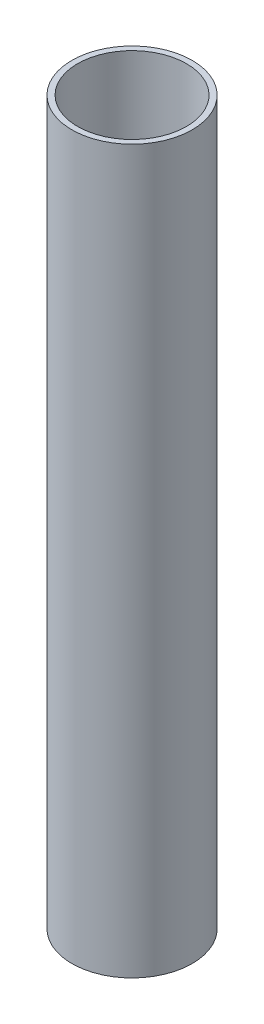
ISO-10303-21;
HEADER;
FILE_DESCRIPTION(('STEP AP214'),'2;1');
FILE_NAME('part.step','',(''),(''),'','','');
FILE_SCHEMA(('AUTOMOTIVE_DESIGN { 1 0 10303 214 1 1 1 1 }'));
ENDSEC;
DATA;
#1=APPLICATION_CONTEXT('core data for automotive mechanical design processes');
#2=APPLICATION_PROTOCOL_DEFINITION('international standard','automotive_design',2000,#1);
#3=PRODUCT_CONTEXT('',#1,'mechanical');
#4=PRODUCT('Part','Part','',(#3));
#5=PRODUCT_RELATED_PRODUCT_CATEGORY('part','',(#4));
#6=PRODUCT_DEFINITION_FORMATION('','',#4);
#7=PRODUCT_DEFINITION_CONTEXT('part definition',#1,'design');
#8=PRODUCT_DEFINITION('design','',#6,#7);
#9=PRODUCT_DEFINITION_SHAPE('','',#8);
#10=(LENGTH_UNIT() NAMED_UNIT(*) SI_UNIT(.MILLI.,.METRE.));
#11=(NAMED_UNIT(*) PLANE_ANGLE_UNIT() SI_UNIT($,.RADIAN.));
#12=(NAMED_UNIT(*) SI_UNIT($,.STERADIAN.) SOLID_ANGLE_UNIT());
#13=UNCERTAINTY_MEASURE_WITH_UNIT(LENGTH_MEASURE(1.E-05),#10,'distance_accuracy_value','');
#14=(GEOMETRIC_REPRESENTATION_CONTEXT(3) GLOBAL_UNCERTAINTY_ASSIGNED_CONTEXT((#13)) GLOBAL_UNIT_ASSIGNED_CONTEXT((#10,
#11,#12)) REPRESENTATION_CONTEXT('',''));
#15=CARTESIAN_POINT('',(0.,0.,0.));
#16=DIRECTION('',(0.,0.,1.));
#17=DIRECTION('',(1.,0.,0.));
#18=AXIS2_PLACEMENT_3D('',#15,#16,#17);
#19=CARTESIAN_POINT('',(0.,304.8,0.));
#20=DIRECTION('',(0.,1.,0.));
#21=DIRECTION('',(0.,0.,1.));
#22=AXIS2_PLACEMENT_3D('',#19,#20,#21);
#23=PLANE('',#22);
#24=CARTESIAN_POINT('',(0.,304.8,0.));
#25=DIRECTION('',(0.,1.,0.));
#26=DIRECTION('',(0.,0.,1.));
#27=AXIS2_PLACEMENT_3D('',#24,#25,#26);
#28=CIRCLE('',#27,25.4);
#29=CARTESIAN_POINT('',(0.,304.8,-25.4));
#30=VERTEX_POINT('',#29);
#31=EDGE_CURVE('E10',#30,#30,#28,.T.);
#32=ORIENTED_EDGE('',*,*,#31,.T.);
#33=EDGE_LOOP('',(#32));
#34=FACE_BOUND('',#33,.T.);
#35=CARTESIAN_POINT('',(0.,304.8,0.));
#36=DIRECTION('',(0.,1.,0.));
#37=DIRECTION('',(0.,0.,1.));
#38=AXIS2_PLACEMENT_3D('',#35,#36,#37);
#39=CIRCLE('',#38,22.987);
#40=CARTESIAN_POINT('',(0.,304.8,-22.987));
#41=VERTEX_POINT('',#40);
#42=EDGE_CURVE('E50',#41,#41,#39,.T.);
#43=ORIENTED_EDGE('',*,*,#42,.F.);
#44=EDGE_LOOP('',(#43));
#45=FACE_BOUND('',#44,.T.);
#46=ADVANCED_FACE('F37',(#34,#45),#23,.T.);
#47=CARTESIAN_POINT('',(0.,0.,0.));
#48=DIRECTION('',(0.,1.,0.));
#49=DIRECTION('',(0.,0.,1.));
#50=AXIS2_PLACEMENT_3D('',#47,#48,#49);
#51=PLANE('',#50);
#52=CARTESIAN_POINT('',(0.,0.,0.));
#53=DIRECTION('',(0.,1.,0.));
#54=DIRECTION('',(0.,0.,1.));
#55=AXIS2_PLACEMENT_3D('',#52,#53,#54);
#56=CIRCLE('',#55,25.4);
#57=CARTESIAN_POINT('',(0.,0.,-25.4));
#58=VERTEX_POINT('',#57);
#59=EDGE_CURVE('E41',#58,#58,#56,.T.);
#60=ORIENTED_EDGE('',*,*,#59,.F.);
#61=EDGE_LOOP('',(#60));
#62=FACE_BOUND('',#61,.T.);
#63=CARTESIAN_POINT('',(0.,0.,0.));
#64=DIRECTION('',(0.,1.,0.));
#65=DIRECTION('',(0.,0.,1.));
#66=AXIS2_PLACEMENT_3D('',#63,#64,#65);
#67=CIRCLE('',#66,22.987);
#68=CARTESIAN_POINT('',(0.,0.,-22.987));
#69=VERTEX_POINT('',#68);
#70=EDGE_CURVE('E52',#69,#69,#67,.T.);
#71=ORIENTED_EDGE('',*,*,#70,.T.);
#72=EDGE_LOOP('',(#71));
#73=FACE_BOUND('',#72,.T.);
#74=ADVANCED_FACE('F64',(#62,#73),#51,.F.);
#75=CARTESIAN_POINT('',(0.,304.8,0.));
#76=DIRECTION('',(0.,-1.,0.));
#77=DIRECTION('',(0.,0.,-1.));
#78=AXIS2_PLACEMENT_3D('',#75,#76,#77);
#79=CYLINDRICAL_SURFACE('',#78,25.4);
#80=CARTESIAN_POINT('',(0.,304.8,-25.4));
#81=CARTESIAN_POINT('',(0.,301.625,-25.4));
#82=CARTESIAN_POINT('',(0.,298.45,-25.4));
#83=CARTESIAN_POINT('',(0.,292.1,-25.4));
#84=CARTESIAN_POINT('',(0.,288.925,-25.4));
#85=CARTESIAN_POINT('',(0.,282.575,-25.4));
#86=CARTESIAN_POINT('',(0.,279.4,-25.4));
#87=CARTESIAN_POINT('',(0.,273.05,-25.4));
#88=CARTESIAN_POINT('',(0.,269.875,-25.4));
#89=CARTESIAN_POINT('',(0.,263.525,-25.4));
#90=CARTESIAN_POINT('',(0.,260.35,-25.4));
#91=CARTESIAN_POINT('',(0.,254.,-25.4));
#92=CARTESIAN_POINT('',(0.,250.825,-25.4));
#93=CARTESIAN_POINT('',(0.,244.475,-25.4));
#94=CARTESIAN_POINT('',(0.,241.3,-25.4));
#95=CARTESIAN_POINT('',(0.,234.95,-25.4));
#96=CARTESIAN_POINT('',(0.,231.775,-25.4));
#97=CARTESIAN_POINT('',(0.,225.425,-25.4));
#98=CARTESIAN_POINT('',(0.,222.25,-25.4));
#99=CARTESIAN_POINT('',(0.,215.9,-25.4));
#100=CARTESIAN_POINT('',(0.,212.725,-25.4));
#101=CARTESIAN_POINT('',(0.,206.375,-25.4));
#102=CARTESIAN_POINT('',(0.,203.2,-25.4));
#103=CARTESIAN_POINT('',(0.,196.85,-25.4));
#104=CARTESIAN_POINT('',(0.,193.675,-25.4));
#105=CARTESIAN_POINT('',(0.,187.325,-25.4));
#106=CARTESIAN_POINT('',(0.,184.15,-25.4));
#107=CARTESIAN_POINT('',(0.,177.8,-25.4));
#108=CARTESIAN_POINT('',(0.,174.625,-25.4));
#109=CARTESIAN_POINT('',(0.,168.275,-25.4));
#110=CARTESIAN_POINT('',(0.,165.1,-25.4));
#111=CARTESIAN_POINT('',(0.,158.75,-25.4));
#112=CARTESIAN_POINT('',(0.,155.575,-25.4));
#113=CARTESIAN_POINT('',(0.,149.225,-25.4));
#114=CARTESIAN_POINT('',(0.,146.05,-25.4));
#115=CARTESIAN_POINT('',(0.,139.7,-25.4));
#116=CARTESIAN_POINT('',(0.,136.525,-25.4));
#117=CARTESIAN_POINT('',(0.,130.175,-25.4));
#118=CARTESIAN_POINT('',(0.,127.,-25.4));
#119=CARTESIAN_POINT('',(0.,120.65,-25.4));
#120=CARTESIAN_POINT('',(0.,117.475,-25.4));
#121=CARTESIAN_POINT('',(0.,111.125,-25.4));
#122=CARTESIAN_POINT('',(0.,107.95,-25.4));
#123=CARTESIAN_POINT('',(0.,101.6,-25.4));
#124=CARTESIAN_POINT('',(0.,98.425,-25.4));
#125=CARTESIAN_POINT('',(0.,92.075,-25.4));
#126=CARTESIAN_POINT('',(0.,88.9,-25.4));
#127=CARTESIAN_POINT('',(0.,82.55,-25.4));
#128=CARTESIAN_POINT('',(0.,79.375,-25.4));
#129=CARTESIAN_POINT('',(0.,73.025,-25.4));
#130=CARTESIAN_POINT('',(0.,69.85,-25.4));
#131=CARTESIAN_POINT('',(0.,63.5,-25.4));
#132=CARTESIAN_POINT('',(0.,60.325,-25.4));
#133=CARTESIAN_POINT('',(0.,53.975,-25.4));
#134=CARTESIAN_POINT('',(0.,50.8,-25.4));
#135=CARTESIAN_POINT('',(0.,44.45,-25.4));
#136=CARTESIAN_POINT('',(0.,41.275,-25.4));
#137=CARTESIAN_POINT('',(0.,34.925,-25.4));
#138=CARTESIAN_POINT('',(0.,31.75,-25.4));
#139=CARTESIAN_POINT('',(0.,25.4,-25.4));
#140=CARTESIAN_POINT('',(0.,22.225,-25.4));
#141=CARTESIAN_POINT('',(0.,15.875,-25.4));
#142=CARTESIAN_POINT('',(0.,12.7,-25.4));
#143=CARTESIAN_POINT('',(0.,6.35,-25.4));
#144=CARTESIAN_POINT('',(0.,3.175,-25.4));
#145=CARTESIAN_POINT('',(0.,0.,-25.4));
#146=B_SPLINE_CURVE_WITH_KNOTS('',3,(#80,#81,#82,#83,#84,#85,#86,#87,#88,#89,#90,#91,#92,#93,
#94,#95,#96,#97,#98,#99,#100,#101,#102,#103,#104,#105,#106,#107,#108,#109,#110,#111,#112,#113,
#114,#115,#116,#117,#118,#119,#120,#121,#122,#123,#124,#125,#126,#127,#128,#129,#130,#131,#132,
#133,#134,#135,#136,#137,#138,#139,#140,#141,#142,#143,#144,#145),.UNSPECIFIED.,.F.,.F.,(4,2,2,
2,2,2,2,2,2,2,2,2,2,2,2,2,2,2,2,2,2,2,2,2,2,2,2,2,2,2,2,2,4),(0.,9.52499999999995,19.05,28.575,
38.1,47.625,57.15,66.675,76.2,85.725,95.2499999999999,104.775,114.3,123.825,133.35,142.875,
152.4,161.925,171.45,180.975,190.5,200.025,209.55,219.075,228.6,238.125,247.65,257.175,266.7,
276.225,285.75,295.275,304.8),.UNSPECIFIED.);
#147=EDGE_CURVE('BSEAM39',#30,#58,#146,.T.);
#148=ORIENTED_EDGE('',*,*,#31,.F.);
#149=ORIENTED_EDGE('',*,*,#59,.T.);
#150=ORIENTED_EDGE('',*,*,#147,.T.);
#151=ORIENTED_EDGE('',*,*,#147,.F.);
#152=EDGE_LOOP('',(#148,#150,#149,#151));
#153=FACE_BOUND('',#152,.T.);
#154=ADVANCED_FACE('F39',(#153),#79,.T.);
#155=CARTESIAN_POINT('',(0.,304.8,0.));
#156=DIRECTION('',(0.,-1.,0.));
#157=DIRECTION('',(0.,0.,-1.));
#158=AXIS2_PLACEMENT_3D('',#155,#156,#157);
#159=CYLINDRICAL_SURFACE('',#158,22.987);
#160=CARTESIAN_POINT('',(0.,304.8,-22.987));
#161=CARTESIAN_POINT('',(0.,301.625,-22.987));
#162=CARTESIAN_POINT('',(0.,298.45,-22.987));
#163=CARTESIAN_POINT('',(0.,292.1,-22.987));
#164=CARTESIAN_POINT('',(0.,288.925,-22.987));
#165=CARTESIAN_POINT('',(0.,282.575,-22.987));
#166=CARTESIAN_POINT('',(0.,279.4,-22.987));
#167=CARTESIAN_POINT('',(0.,273.05,-22.987));
#168=CARTESIAN_POINT('',(0.,269.875,-22.987));
#169=CARTESIAN_POINT('',(0.,263.525,-22.987));
#170=CARTESIAN_POINT('',(0.,260.35,-22.987));
#171=CARTESIAN_POINT('',(0.,254.,-22.987));
#172=CARTESIAN_POINT('',(0.,250.825,-22.987));
#173=CARTESIAN_POINT('',(0.,244.475,-22.987));
#174=CARTESIAN_POINT('',(0.,241.3,-22.987));
#175=CARTESIAN_POINT('',(0.,234.95,-22.987));
#176=CARTESIAN_POINT('',(0.,231.775,-22.987));
#177=CARTESIAN_POINT('',(0.,225.425,-22.987));
#178=CARTESIAN_POINT('',(0.,222.25,-22.987));
#179=CARTESIAN_POINT('',(0.,215.9,-22.987));
#180=CARTESIAN_POINT('',(0.,212.725,-22.987));
#181=CARTESIAN_POINT('',(0.,206.375,-22.987));
#182=CARTESIAN_POINT('',(0.,203.2,-22.987));
#183=CARTESIAN_POINT('',(0.,196.85,-22.987));
#184=CARTESIAN_POINT('',(0.,193.675,-22.987));
#185=CARTESIAN_POINT('',(0.,187.325,-22.987));
#186=CARTESIAN_POINT('',(0.,184.15,-22.987));
#187=CARTESIAN_POINT('',(0.,177.8,-22.987));
#188=CARTESIAN_POINT('',(0.,174.625,-22.987));
#189=CARTESIAN_POINT('',(0.,168.275,-22.987));
#190=CARTESIAN_POINT('',(0.,165.1,-22.987));
#191=CARTESIAN_POINT('',(0.,158.75,-22.987));
#192=CARTESIAN_POINT('',(0.,155.575,-22.987));
#193=CARTESIAN_POINT('',(0.,149.225,-22.987));
#194=CARTESIAN_POINT('',(0.,146.05,-22.987));
#195=CARTESIAN_POINT('',(0.,139.7,-22.987));
#196=CARTESIAN_POINT('',(0.,136.525,-22.987));
#197=CARTESIAN_POINT('',(0.,130.175,-22.987));
#198=CARTESIAN_POINT('',(0.,127.,-22.987));
#199=CARTESIAN_POINT('',(0.,120.65,-22.987));
#200=CARTESIAN_POINT('',(0.,117.475,-22.987));
#201=CARTESIAN_POINT('',(0.,111.125,-22.987));
#202=CARTESIAN_POINT('',(0.,107.95,-22.987));
#203=CARTESIAN_POINT('',(0.,101.6,-22.987));
#204=CARTESIAN_POINT('',(0.,98.425,-22.987));
#205=CARTESIAN_POINT('',(0.,92.075,-22.987));
#206=CARTESIAN_POINT('',(0.,88.9,-22.987));
#207=CARTESIAN_POINT('',(0.,82.55,-22.987));
#208=CARTESIAN_POINT('',(0.,79.375,-22.987));
#209=CARTESIAN_POINT('',(0.,73.025,-22.987));
#210=CARTESIAN_POINT('',(0.,69.85,-22.987));
#211=CARTESIAN_POINT('',(0.,63.5,-22.987));
#212=CARTESIAN_POINT('',(0.,60.325,-22.987));
#213=CARTESIAN_POINT('',(0.,53.975,-22.987));
#214=CARTESIAN_POINT('',(0.,50.8,-22.987));
#215=CARTESIAN_POINT('',(0.,44.45,-22.987));
#216=CARTESIAN_POINT('',(0.,41.275,-22.987));
#217=CARTESIAN_POINT('',(0.,34.925,-22.987));
#218=CARTESIAN_POINT('',(0.,31.75,-22.987));
#219=CARTESIAN_POINT('',(0.,25.4,-22.987));
#220=CARTESIAN_POINT('',(0.,22.225,-22.987));
#221=CARTESIAN_POINT('',(0.,15.875,-22.987));
#222=CARTESIAN_POINT('',(0.,12.7,-22.987));
#223=CARTESIAN_POINT('',(0.,6.35,-22.987));
#224=CARTESIAN_POINT('',(0.,3.175,-22.987));
#225=CARTESIAN_POINT('',(0.,0.,-22.987));
#226=B_SPLINE_CURVE_WITH_KNOTS('',3,(#160,#161,#162,#163,#164,#165,#166,#167,#168,#169,#170,
#171,#172,#173,#174,#175,#176,#177,#178,#179,#180,#181,#182,#183,#184,#185,#186,#187,#188,#189,
#190,#191,#192,#193,#194,#195,#196,#197,#198,#199,#200,#201,#202,#203,#204,#205,#206,#207,#208,
#209,#210,#211,#212,#213,#214,#215,#216,#217,#218,#219,#220,#221,#222,#223,#224,#225),
.UNSPECIFIED.,.F.,.F.,(4,2,2,2,2,2,2,2,2,2,2,2,2,2,2,2,2,2,2,2,2,2,2,2,2,2,2,2,2,2,2,2,4),(0.,
9.52500000000001,19.05,28.575,38.1,47.625,57.15,66.675,76.2,85.7250000000001,95.2500000000001,
104.775,114.3,123.825,133.35,142.875,152.4,161.925,171.45,180.975,190.5,200.025,209.55,219.075,
228.6,238.125,247.65,257.175,266.7,276.225,285.75,295.275,304.8),.UNSPECIFIED.);
#227=EDGE_CURVE('BSEAM60',#41,#69,#226,.T.);
#228=ORIENTED_EDGE('',*,*,#42,.T.);
#229=ORIENTED_EDGE('',*,*,#70,.F.);
#230=ORIENTED_EDGE('',*,*,#227,.T.);
#231=ORIENTED_EDGE('',*,*,#227,.F.);
#232=EDGE_LOOP('',(#228,#230,#229,#231));
#233=FACE_BOUND('',#232,.T.);
#234=ADVANCED_FACE('F60',(#233),#159,.F.);
#235=CLOSED_SHELL('',(#46,#74,#154,#234));
#236=MANIFOLD_SOLID_BREP('B2',#235);
#237=ADVANCED_BREP_SHAPE_REPRESENTATION('',(#18,#236),#14);
#238=SHAPE_DEFINITION_REPRESENTATION(#9,#237);
ENDSEC;
END-ISO-10303-21;
